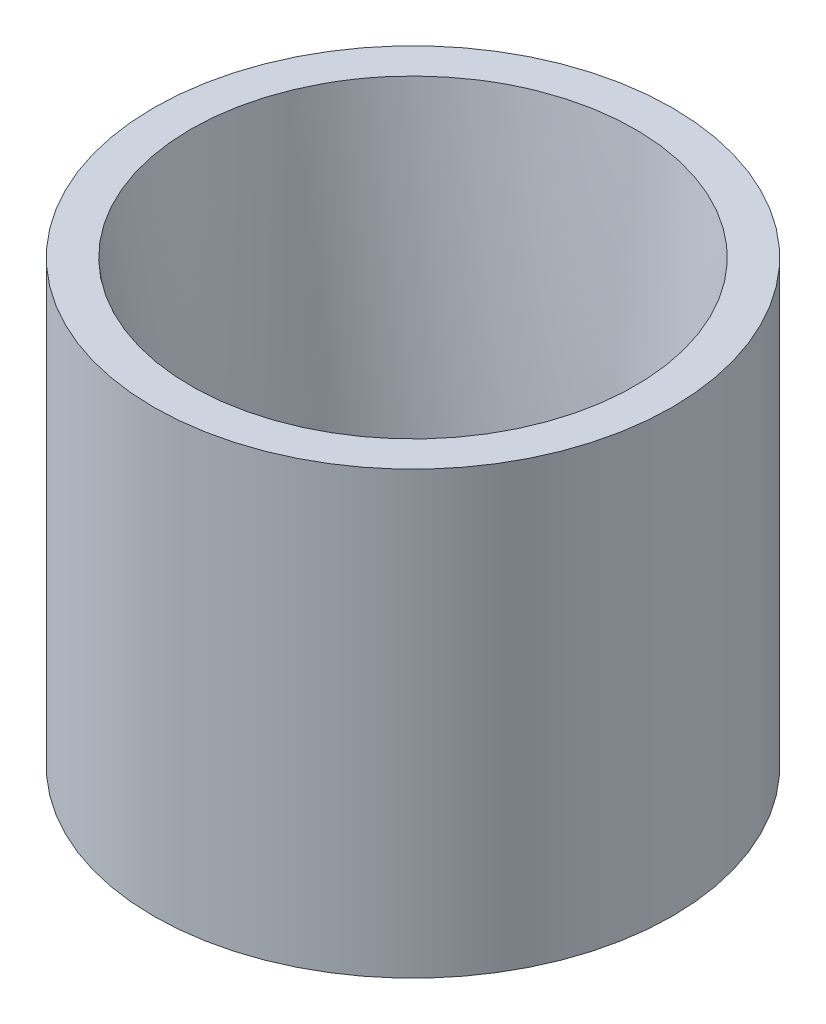
ISO-10303-21;
HEADER;
FILE_DESCRIPTION(('STEP AP214'),'2;1');
FILE_NAME('part.step','',(''),(''),'','','');
FILE_SCHEMA(('AUTOMOTIVE_DESIGN { 1 0 10303 214 1 1 1 1 }'));
ENDSEC;
DATA;
#1=APPLICATION_CONTEXT('core data for automotive mechanical design processes');
#2=APPLICATION_PROTOCOL_DEFINITION('international standard','automotive_design',2000,#1);
#3=PRODUCT_CONTEXT('',#1,'mechanical');
#4=PRODUCT('Part','Part','',(#3));
#5=PRODUCT_RELATED_PRODUCT_CATEGORY('part','',(#4));
#6=PRODUCT_DEFINITION_FORMATION('','',#4);
#7=PRODUCT_DEFINITION_CONTEXT('part definition',#1,'design');
#8=PRODUCT_DEFINITION('design','',#6,#7);
#9=PRODUCT_DEFINITION_SHAPE('','',#8);
#10=(LENGTH_UNIT() NAMED_UNIT(*) SI_UNIT(.MILLI.,.METRE.));
#11=(NAMED_UNIT(*) PLANE_ANGLE_UNIT() SI_UNIT($,.RADIAN.));
#12=(NAMED_UNIT(*) SI_UNIT($,.STERADIAN.) SOLID_ANGLE_UNIT());
#13=UNCERTAINTY_MEASURE_WITH_UNIT(LENGTH_MEASURE(1.E-05),#10,'distance_accuracy_value','');
#14=(GEOMETRIC_REPRESENTATION_CONTEXT(3) GLOBAL_UNCERTAINTY_ASSIGNED_CONTEXT((#13)) GLOBAL_UNIT_ASSIGNED_CONTEXT((#10,
#11,#12)) REPRESENTATION_CONTEXT('',''));
#15=CARTESIAN_POINT('',(0.,0.,0.));
#16=DIRECTION('',(0.,0.,1.));
#17=DIRECTION('',(1.,0.,0.));
#18=AXIS2_PLACEMENT_3D('',#15,#16,#17);
#19=CARTESIAN_POINT('',(0.,59.5,0.));
#20=DIRECTION('',(0.,-1.,0.));
#21=DIRECTION('',(0.,0.,-1.));
#22=AXIS2_PLACEMENT_3D('',#19,#20,#21);
#23=CYLINDRICAL_SURFACE('',#22,35.);
#24=CARTESIAN_POINT('',(0.,59.5,0.));
#25=DIRECTION('',(0.,1.,0.));
#26=DIRECTION('',(0.,0.,1.));
#27=AXIS2_PLACEMENT_3D('',#24,#25,#26);
#28=CIRCLE('',#27,35.);
#29=CARTESIAN_POINT('',(0.,59.5,35.));
#30=VERTEX_POINT('',#29);
#31=EDGE_CURVE('E11',#30,#30,#28,.T.);
#32=ORIENTED_EDGE('',*,*,#31,.F.);
#33=EDGE_LOOP('',(#32));
#34=FACE_BOUND('',#33,.T.);
#35=CARTESIAN_POINT('',(0.,0.,0.));
#36=DIRECTION('',(0.,1.,0.));
#37=DIRECTION('',(0.,0.,1.));
#38=AXIS2_PLACEMENT_3D('',#35,#36,#37);
#39=CIRCLE('',#38,35.);
#40=CARTESIAN_POINT('',(0.,0.,35.));
#41=VERTEX_POINT('',#40);
#42=EDGE_CURVE('E37',#41,#41,#39,.T.);
#43=ORIENTED_EDGE('',*,*,#42,.T.);
#44=EDGE_LOOP('',(#43));
#45=FACE_BOUND('',#44,.T.);
#46=ADVANCED_FACE('F34',(#34,#45),#23,.T.);
#47=CARTESIAN_POINT('',(0.,59.5,0.));
#48=DIRECTION('',(0.,1.,0.));
#49=DIRECTION('',(0.,0.,1.));
#50=AXIS2_PLACEMENT_3D('',#47,#48,#49);
#51=PLANE('',#50);
#52=CARTESIAN_POINT('',(0.,59.5,0.));
#53=DIRECTION('',(0.,1.,0.));
#54=DIRECTION('',(0.,0.,1.));
#55=AXIS2_PLACEMENT_3D('',#52,#53,#54);
#56=CIRCLE('',#55,30.);
#57=CARTESIAN_POINT('',(19.8958502843088,59.5,22.4533993298202));
#58=VERTEX_POINT('',#57);
#59=EDGE_CURVE('E50',#58,#58,#56,.T.);
#60=ORIENTED_EDGE('',*,*,#59,.F.);
#61=EDGE_LOOP('',(#60));
#62=FACE_BOUND('',#61,.T.);
#63=ORIENTED_EDGE('',*,*,#31,.T.);
#64=EDGE_LOOP('',(#63));
#65=FACE_BOUND('',#64,.T.);
#66=ADVANCED_FACE('F72',(#62,#65),#51,.T.);
#67=CARTESIAN_POINT('',(0.,0.,0.));
#68=DIRECTION('',(0.,1.,0.));
#69=DIRECTION('',(0.,0.,1.));
#70=AXIS2_PLACEMENT_3D('',#67,#68,#69);
#71=PLANE('',#70);
#72=ORIENTED_EDGE('',*,*,#42,.F.);
#73=EDGE_LOOP('',(#72));
#74=FACE_BOUND('',#73,.T.);
#75=ADVANCED_FACE('F67',(#74),#71,.F.);
#76=CARTESIAN_POINT('',(0.,5.,0.));
#77=DIRECTION('',(0.,1.,0.));
#78=DIRECTION('',(0.,0.,1.));
#79=AXIS2_PLACEMENT_3D('',#76,#77,#78);
#80=PLANE('',#79);
#81=CARTESIAN_POINT('',(0.,5.,0.));
#82=DIRECTION('',(0.,1.,0.));
#83=DIRECTION('',(0.,0.,1.));
#84=AXIS2_PLACEMENT_3D('',#81,#82,#83);
#85=CIRCLE('',#84,25.5);
#86=CARTESIAN_POINT('',(23.1273732280285,5.,10.7412572621397));
#87=VERTEX_POINT('',#86);
#88=EDGE_CURVE('E44',#87,#87,#85,.T.);
#89=ORIENTED_EDGE('',*,*,#88,.T.);
#90=EDGE_LOOP('',(#89));
#91=FACE_BOUND('',#90,.T.);
#92=ADVANCED_FACE('F56',(#91),#80,.T.);
#93=CARTESIAN_POINT('',(19.8958502843088,59.5,22.4533993298202));
#94=CARTESIAN_POINT('',(23.1273732280285,5.,10.7412572621397));
#95=CARTESIAN_POINT('',(-25.0109483753316,59.5,62.2450998984378));
#96=CARTESIAN_POINT('',(1.64485870374904,5.,56.9960037181968));
#97=CARTESIAN_POINT('',(-64.8026489439492,59.5,17.3383012387973));
#98=CARTESIAN_POINT('',(-44.609887752308,5.,35.5134891939173));
#99=CARTESIAN_POINT('',(-19.8958502843088,59.5,-22.4533993298202));
#100=CARTESIAN_POINT('',(-23.1273732280285,5.,-10.7412572621397));
#101=CARTESIAN_POINT('',(25.0109483753316,59.5,-62.2450998984378));
#102=CARTESIAN_POINT('',(-1.64485870374903,5.,-56.9960037181968));
#103=CARTESIAN_POINT('',(64.8026489439492,59.5,-17.3383012387974));
#104=CARTESIAN_POINT('',(44.609887752308,5.,-35.5134891939173));
#105=CARTESIAN_POINT('',(19.8958502843088,59.5,22.4533993298202));
#106=CARTESIAN_POINT('',(23.1273732280285,5.,10.7412572621397));
#107=(BOUNDED_SURFACE() B_SPLINE_SURFACE(3,1,((#93,#94),(#95,#96),(#97,#98),(#99,#100),(#101,
#102),(#103,#104),(#105,#106)),.UNSPECIFIED.,.T.,.F.,.F.) B_SPLINE_SURFACE_WITH_KNOTS((4,3,4),
(2,2),(0.,0.5,1.),(0.,1.),
.UNSPECIFIED.) GEOMETRIC_REPRESENTATION_ITEM() RATIONAL_B_SPLINE_SURFACE(((1.,1.),
(0.333333333333333,0.333333333333333),(0.333333333333333,0.333333333333333),(1.,1.),
(0.333333333333333,0.333333333333333),(0.333333333333333,0.333333333333333),(1.,1.))) REPRESENTATION_ITEM('') SURFACE());
#108=CARTESIAN_POINT('',(19.8958502843088,59.5,22.4533993298202));
#109=CARTESIAN_POINT('',(19.9295119816392,58.9322916666667,22.3313978499485));
#110=CARTESIAN_POINT('',(19.9631736789696,58.3645833333333,22.2093963700769));
#111=CARTESIAN_POINT('',(20.0304970736304,57.2291666666667,21.9653934103335));
#112=CARTESIAN_POINT('',(20.0641587709608,56.6614583333333,21.8433919304618));
#113=CARTESIAN_POINT('',(20.1314821656217,55.5260416666667,21.5993889707185));
#114=CARTESIAN_POINT('',(20.1651438629521,54.9583333333333,21.4773874908468));
#115=CARTESIAN_POINT('',(20.2324672576129,53.8229166666667,21.2333845311035));
#116=CARTESIAN_POINT('',(20.2661289549433,53.2552083333333,21.1113830512318));
#117=CARTESIAN_POINT('',(20.3334523496042,52.1197916666667,20.8673800914885));
#118=CARTESIAN_POINT('',(20.3671140469346,51.5520833333333,20.7453786116168));
#119=CARTESIAN_POINT('',(20.4344374415954,50.4166666666667,20.5013756518735));
#120=CARTESIAN_POINT('',(20.4680991389258,49.8489583333333,20.3793741720018));
#121=CARTESIAN_POINT('',(20.5354225335866,48.7135416666667,20.1353712122584));
#122=CARTESIAN_POINT('',(20.5690842309171,48.1458333333333,20.0133697323868));
#123=CARTESIAN_POINT('',(20.6364076255779,47.0104166666667,19.7693667726434));
#124=CARTESIAN_POINT('',(20.6700693229083,46.4427083333333,19.6473652927718));
#125=CARTESIAN_POINT('',(20.7373927175691,45.3072916666667,19.4033623330284));
#126=CARTESIAN_POINT('',(20.7710544148995,44.7395833333333,19.2813608531567));
#127=CARTESIAN_POINT('',(20.8383778095604,43.6041666666667,19.0373578934134));
#128=CARTESIAN_POINT('',(20.8720395068908,43.0364583333333,18.9153564135417));
#129=CARTESIAN_POINT('',(20.9393629015516,41.9010416666667,18.6713534537984));
#130=CARTESIAN_POINT('',(20.973024598882,41.3333333333333,18.5493519739267));
#131=CARTESIAN_POINT('',(21.0403479935429,40.1979166666667,18.3053490141834));
#132=CARTESIAN_POINT('',(21.0740096908733,39.6302083333333,18.1833475343117));
#133=CARTESIAN_POINT('',(21.1413330855341,38.4947916666667,17.9393445745684));
#134=CARTESIAN_POINT('',(21.1749947828645,37.9270833333333,17.8173430946967));
#135=CARTESIAN_POINT('',(21.2423181775253,36.7916666666667,17.5733401349533));
#136=CARTESIAN_POINT('',(21.2759798748558,36.2239583333333,17.4513386550817));
#137=CARTESIAN_POINT('',(21.3433032695166,35.0885416666667,17.2073356953383));
#138=CARTESIAN_POINT('',(21.376964966847,34.5208333333333,17.0853342154667));
#139=CARTESIAN_POINT('',(21.4442883615078,33.3854166666667,16.8413312557233));
#140=CARTESIAN_POINT('',(21.4779500588382,32.8177083333333,16.7193297758516));
#141=CARTESIAN_POINT('',(21.5452734534991,31.6822916666667,16.4753268161083));
#142=CARTESIAN_POINT('',(21.5789351508295,31.1145833333333,16.3533253362366));
#143=CARTESIAN_POINT('',(21.6462585454903,29.9791666666667,16.1093223764933));
#144=CARTESIAN_POINT('',(21.6799202428207,29.4114583333333,15.9873208966216));
#145=CARTESIAN_POINT('',(21.7472436374815,28.2760416666667,15.7433179368783));
#146=CARTESIAN_POINT('',(21.780905334812,27.7083333333333,15.6213164570066));
#147=CARTESIAN_POINT('',(21.8482287294728,26.5729166666667,15.3773134972633));
#148=CARTESIAN_POINT('',(21.8818904268032,26.0052083333333,15.2553120173916));
#149=CARTESIAN_POINT('',(21.949213821464,24.8697916666667,15.0113090576482));
#150=CARTESIAN_POINT('',(21.9828755187944,24.3020833333333,14.8893075777766));
#151=CARTESIAN_POINT('',(22.0501989134553,23.1666666666667,14.6453046180332));
#152=CARTESIAN_POINT('',(22.0838606107857,22.5989583333333,14.5233031381616));
#153=CARTESIAN_POINT('',(22.1511840054465,21.4635416666667,14.2793001784182));
#154=CARTESIAN_POINT('',(22.1848457027769,20.8958333333333,14.1572986985465));
#155=CARTESIAN_POINT('',(22.2521690974378,19.7604166666667,13.9132957388032));
#156=CARTESIAN_POINT('',(22.2858307947682,19.1927083333333,13.7912942589315));
#157=CARTESIAN_POINT('',(22.353154189429,18.0572916666667,13.5472912991882));
#158=CARTESIAN_POINT('',(22.3868158867594,17.4895833333333,13.4252898193165));
#159=CARTESIAN_POINT('',(22.4541392814202,16.3541666666667,13.1812868595732));
#160=CARTESIAN_POINT('',(22.4878009787507,15.7864583333333,13.0592853797015));
#161=CARTESIAN_POINT('',(22.5551243734115,14.6510416666667,12.8152824199582));
#162=CARTESIAN_POINT('',(22.5887860707419,14.0833333333333,12.6932809400865));
#163=CARTESIAN_POINT('',(22.6561094654027,12.9479166666667,12.4492779803431));
#164=CARTESIAN_POINT('',(22.6897711627331,12.3802083333333,12.3272765004715));
#165=CARTESIAN_POINT('',(22.757094557394,11.2447916666667,12.0832735407281));
#166=CARTESIAN_POINT('',(22.7907562547244,10.6770833333333,11.9612720608565));
#167=CARTESIAN_POINT('',(22.8580796493852,9.54166666666667,11.7172691011131));
#168=CARTESIAN_POINT('',(22.8917413467156,8.97395833333333,11.5952676212414));
#169=CARTESIAN_POINT('',(22.9590647413765,7.83854166666667,11.3512646614981));
#170=CARTESIAN_POINT('',(22.9927264387069,7.27083333333333,11.2292631816264));
#171=CARTESIAN_POINT('',(23.0600498333677,6.13541666666667,10.9852602218831));
#172=CARTESIAN_POINT('',(23.0937115306981,5.56770833333333,10.8632587420114));
#173=CARTESIAN_POINT('',(23.1273732280285,5.,10.7412572621397));
#174=B_SPLINE_CURVE_WITH_KNOTS('',3,(#108,#109,#110,#111,#112,#113,#114,#115,#116,#117,#118,
#119,#120,#121,#122,#123,#124,#125,#126,#127,#128,#129,#130,#131,#132,#133,#134,#135,#136,#137,
#138,#139,#140,#141,#142,#143,#144,#145,#146,#147,#148,#149,#150,#151,#152,#153,#154,#155,#156,
#157,#158,#159,#160,#161,#162,#163,#164,#165,#166,#167,#168,#169,#170,#171,#172,#173),
.UNSPECIFIED.,.F.,.F.,(4,2,2,2,2,2,2,2,2,2,2,2,2,2,2,2,2,2,2,2,2,2,2,2,2,2,2,2,2,2,2,2,4),(0.,
1.74493323776223,3.48986647552446,5.2347997132867,6.97973295104892,8.72466618881115,
10.4695994265734,12.2145326643356,13.9594659020978,15.7043991398601,17.4493323776223,
19.1942656153845,20.9391988531468,22.684132090909,24.4290653286712,26.1739985664335,
27.9189318041957,29.6638650419579,31.4087982797201,33.1537315174824,34.8986647552446,
36.6435979930068,38.3885312307691,40.1334644685313,41.8783977062935,43.6233309440558,
45.368264181818,47.1131974195802,48.8581306573424,50.6030638951047,52.3479971328669,
54.0929303706291,55.8378636083914),.UNSPECIFIED.);
#175=EDGE_CURVE('BSEAM66',#58,#87,#174,.T.);
#176=ORIENTED_EDGE('',*,*,#59,.T.);
#177=ORIENTED_EDGE('',*,*,#88,.F.);
#178=ORIENTED_EDGE('',*,*,#175,.T.);
#179=ORIENTED_EDGE('',*,*,#175,.F.);
#180=EDGE_LOOP('',(#176,#178,#177,#179));
#181=FACE_BOUND('',#180,.T.);
#182=ADVANCED_FACE('F66',(#181),#107,.F.);
#183=CLOSED_SHELL('',(#46,#66,#75,#92,#182));
#184=MANIFOLD_SOLID_BREP('B2',#183);
#185=ADVANCED_BREP_SHAPE_REPRESENTATION('',(#18,#184),#14);
#186=SHAPE_DEFINITION_REPRESENTATION(#9,#185);
ENDSEC;
END-ISO-10303-21;
